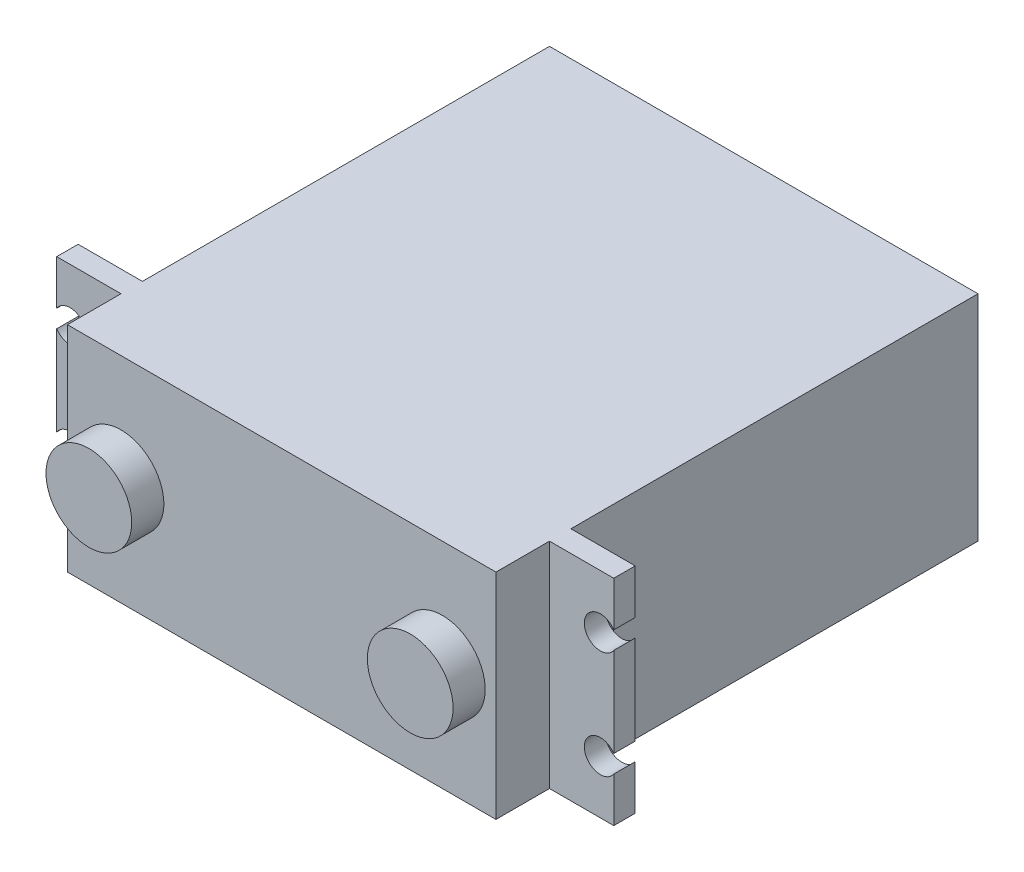
ISO-10303-21;
HEADER;
FILE_DESCRIPTION(('STEP AP214'),'2;1');
FILE_NAME('part.step','',(''),(''),'','','');
FILE_SCHEMA(('AUTOMOTIVE_DESIGN { 1 0 10303 214 1 1 1 1 }'));
ENDSEC;
DATA;
#1=APPLICATION_CONTEXT('core data for automotive mechanical design processes');
#2=APPLICATION_PROTOCOL_DEFINITION('international standard','automotive_design',2000,#1);
#3=PRODUCT_CONTEXT('',#1,'mechanical');
#4=PRODUCT('Part','Part','',(#3));
#5=PRODUCT_RELATED_PRODUCT_CATEGORY('part','',(#4));
#6=PRODUCT_DEFINITION_FORMATION('','',#4);
#7=PRODUCT_DEFINITION_CONTEXT('part definition',#1,'design');
#8=PRODUCT_DEFINITION('design','',#6,#7);
#9=PRODUCT_DEFINITION_SHAPE('','',#8);
#10=(LENGTH_UNIT() NAMED_UNIT(*) SI_UNIT(.MILLI.,.METRE.));
#11=(NAMED_UNIT(*) PLANE_ANGLE_UNIT() SI_UNIT($,.RADIAN.));
#12=(NAMED_UNIT(*) SI_UNIT($,.STERADIAN.) SOLID_ANGLE_UNIT());
#13=UNCERTAINTY_MEASURE_WITH_UNIT(LENGTH_MEASURE(1.E-05),#10,'distance_accuracy_value','');
#14=(GEOMETRIC_REPRESENTATION_CONTEXT(3) GLOBAL_UNCERTAINTY_ASSIGNED_CONTEXT((#13)) GLOBAL_UNIT_ASSIGNED_CONTEXT((#10,
#11,#12)) REPRESENTATION_CONTEXT('',''));
#15=CARTESIAN_POINT('',(0.,0.,0.));
#16=DIRECTION('',(0.,0.,1.));
#17=DIRECTION('',(1.,0.,0.));
#18=AXIS2_PLACEMENT_3D('',#15,#16,#17);
#19=CARTESIAN_POINT('',(-6.,0.,0.));
#20=DIRECTION('',(-1.,0.,0.));
#21=DIRECTION('',(0.,0.,1.));
#22=AXIS2_PLACEMENT_3D('',#19,#20,#21);
#23=PLANE('',#22);
#24=DIRECTION('',(0.,0.,1.));
#25=VECTOR('',#24,1.);
#26=CARTESIAN_POINT('',(-6.,4.17084380241115,34.));
#27=LINE('',#26,#25);
#28=CARTESIAN_POINT('',(-6.,4.17084380241115,38.));
#29=VERTEX_POINT('',#28);
#30=CARTESIAN_POINT('',(-6.,4.17084380241115,40.));
#31=VERTEX_POINT('',#30);
#32=EDGE_CURVE('E48',#29,#31,#27,.T.);
#33=ORIENTED_EDGE('',*,*,#32,.F.);
#34=DIRECTION('',(0.,-1.,0.));
#35=VECTOR('',#34,1.);
#36=CARTESIAN_POINT('',(-6.,20.,38.));
#37=LINE('',#36,#35);
#38=CARTESIAN_POINT('',(-6.,0.,38.));
#39=VERTEX_POINT('',#38);
#40=EDGE_CURVE('E230',#29,#39,#37,.T.);
#41=ORIENTED_EDGE('',*,*,#40,.T.);
#42=DIRECTION('',(0.,0.,1.));
#43=VECTOR('',#42,1.);
#44=CARTESIAN_POINT('',(-6.,0.,38.));
#45=LINE('',#44,#43);
#46=CARTESIAN_POINT('',(-6.,0.,40.));
#47=VERTEX_POINT('',#46);
#48=EDGE_CURVE('E228',#39,#47,#45,.T.);
#49=ORIENTED_EDGE('',*,*,#48,.T.);
#50=DIRECTION('',(0.,1.,0.));
#51=VECTOR('',#50,1.);
#52=CARTESIAN_POINT('',(-6.,20.,40.));
#53=LINE('',#52,#51);
#54=EDGE_CURVE('E233',#47,#31,#53,.T.);
#55=ORIENTED_EDGE('',*,*,#54,.T.);
#56=EDGE_LOOP('',(#33,#41,#49,#55));
#57=FACE_BOUND('',#56,.T.);
#58=ADVANCED_FACE('F33',(#57),#23,.T.);
#59=CARTESIAN_POINT('',(46.,0.,0.));
#60=DIRECTION('',(1.,0.,0.));
#61=DIRECTION('',(0.,0.,-1.));
#62=AXIS2_PLACEMENT_3D('',#59,#60,#61);
#63=PLANE('',#62);
#64=DIRECTION('',(0.,0.,1.));
#65=VECTOR('',#64,1.);
#66=CARTESIAN_POINT('',(46.,15.8291561975889,34.));
#67=LINE('',#66,#65);
#68=CARTESIAN_POINT('',(46.,15.8291561975889,38.));
#69=VERTEX_POINT('',#68);
#70=CARTESIAN_POINT('',(46.,15.8291561975889,40.));
#71=VERTEX_POINT('',#70);
#72=EDGE_CURVE('E41',#69,#71,#67,.T.);
#73=ORIENTED_EDGE('',*,*,#72,.F.);
#74=DIRECTION('',(0.,1.,0.));
#75=VECTOR('',#74,1.);
#76=CARTESIAN_POINT('',(46.,20.,38.));
#77=LINE('',#76,#75);
#78=CARTESIAN_POINT('',(46.,20.,38.));
#79=VERTEX_POINT('',#78);
#80=EDGE_CURVE('E200',#69,#79,#77,.T.);
#81=ORIENTED_EDGE('',*,*,#80,.T.);
#82=DIRECTION('',(0.,0.,1.));
#83=VECTOR('',#82,1.);
#84=CARTESIAN_POINT('',(46.,20.,40.));
#85=LINE('',#84,#83);
#86=CARTESIAN_POINT('',(46.,20.,40.));
#87=VERTEX_POINT('',#86);
#88=EDGE_CURVE('E204',#79,#87,#85,.T.);
#89=ORIENTED_EDGE('',*,*,#88,.T.);
#90=DIRECTION('',(0.,-1.,0.));
#91=VECTOR('',#90,1.);
#92=CARTESIAN_POINT('',(46.,20.,40.));
#93=LINE('',#92,#91);
#94=EDGE_CURVE('E190',#87,#71,#93,.T.);
#95=ORIENTED_EDGE('',*,*,#94,.T.);
#96=EDGE_LOOP('',(#73,#81,#89,#95));
#97=FACE_BOUND('',#96,.T.);
#98=ADVANCED_FACE('F318',(#97),#63,.T.);
#99=DIRECTION('',(0.,0.,1.));
#100=VECTOR('',#99,1.);
#101=CARTESIAN_POINT('',(46.,14.1708438024111,34.));
#102=LINE('',#101,#100);
#103=CARTESIAN_POINT('',(46.,14.1708438024111,40.));
#104=VERTEX_POINT('',#103);
#105=CARTESIAN_POINT('',(46.,14.1708438024111,38.));
#106=VERTEX_POINT('',#105);
#107=EDGE_CURVE('E175',#104,#106,#102,.F.);
#108=ORIENTED_EDGE('',*,*,#107,.F.);
#109=CARTESIAN_POINT('',(46.,5.82915619758885,40.));
#110=VERTEX_POINT('',#109);
#111=EDGE_CURVE('E183',#104,#110,#93,.T.);
#112=ORIENTED_EDGE('',*,*,#111,.T.);
#113=DIRECTION('',(0.,0.,1.));
#114=VECTOR('',#113,1.);
#115=CARTESIAN_POINT('',(46.,5.82915619758885,34.));
#116=LINE('',#115,#114);
#117=CARTESIAN_POINT('',(46.,5.82915619758885,38.));
#118=VERTEX_POINT('',#117);
#119=EDGE_CURVE('E167',#118,#110,#116,.T.);
#120=ORIENTED_EDGE('',*,*,#119,.F.);
#121=EDGE_CURVE('E205',#118,#106,#77,.T.);
#122=ORIENTED_EDGE('',*,*,#121,.T.);
#123=EDGE_LOOP('',(#108,#112,#120,#122));
#124=FACE_BOUND('',#123,.T.);
#125=ADVANCED_FACE('F189',(#124),#63,.T.);
#126=DIRECTION('',(0.,0.,1.));
#127=VECTOR('',#126,1.);
#128=CARTESIAN_POINT('',(-6.,5.82915619758885,34.));
#129=LINE('',#128,#127);
#130=CARTESIAN_POINT('',(-6.,5.82915619758885,40.));
#131=VERTEX_POINT('',#130);
#132=CARTESIAN_POINT('',(-6.,5.82915619758885,38.));
#133=VERTEX_POINT('',#132);
#134=EDGE_CURVE('E346',#131,#133,#129,.F.);
#135=ORIENTED_EDGE('',*,*,#134,.F.);
#136=CARTESIAN_POINT('',(-6.,14.1708438024112,40.));
#137=VERTEX_POINT('',#136);
#138=EDGE_CURVE('E237',#131,#137,#53,.T.);
#139=ORIENTED_EDGE('',*,*,#138,.T.);
#140=DIRECTION('',(0.,0.,1.));
#141=VECTOR('',#140,1.);
#142=CARTESIAN_POINT('',(-6.,14.1708438024112,34.));
#143=LINE('',#142,#141);
#144=CARTESIAN_POINT('',(-6.,14.1708438024112,38.));
#145=VERTEX_POINT('',#144);
#146=EDGE_CURVE('E305',#145,#137,#143,.T.);
#147=ORIENTED_EDGE('',*,*,#146,.F.);
#148=EDGE_CURVE('E229',#145,#133,#37,.T.);
#149=ORIENTED_EDGE('',*,*,#148,.T.);
#150=EDGE_LOOP('',(#135,#139,#147,#149));
#151=FACE_BOUND('',#150,.T.);
#152=ADVANCED_FACE('F377',(#151),#23,.T.);
#153=CARTESIAN_POINT('',(40.,0.,45.));
#154=DIRECTION('',(-1.,0.,0.));
#155=DIRECTION('',(0.,0.,1.));
#156=AXIS2_PLACEMENT_3D('',#153,#154,#155);
#157=PLANE('',#156);
#158=DIRECTION('',(0.,-1.,0.));
#159=VECTOR('',#158,1.);
#160=CARTESIAN_POINT('',(40.,20.,40.));
#161=LINE('',#160,#159);
#162=CARTESIAN_POINT('',(40.,20.,40.));
#163=VERTEX_POINT('',#162);
#164=CARTESIAN_POINT('',(40.,0.,40.));
#165=VERTEX_POINT('',#164);
#166=EDGE_CURVE('E208',#163,#165,#161,.T.);
#167=ORIENTED_EDGE('',*,*,#166,.F.);
#168=DIRECTION('',(0.,0.,-1.));
#169=VECTOR('',#168,1.);
#170=CARTESIAN_POINT('',(40.,20.,45.));
#171=LINE('',#170,#169);
#172=CARTESIAN_POINT('',(40.,20.,45.));
#173=VERTEX_POINT('',#172);
#174=EDGE_CURVE('E287',#173,#163,#171,.T.);
#175=ORIENTED_EDGE('',*,*,#174,.F.);
#176=DIRECTION('',(0.,1.,0.));
#177=VECTOR('',#176,1.);
#178=CARTESIAN_POINT('',(40.,0.,45.));
#179=LINE('',#178,#177);
#180=CARTESIAN_POINT('',(40.,0.,45.));
#181=VERTEX_POINT('',#180);
#182=EDGE_CURVE('E269',#181,#173,#179,.T.);
#183=ORIENTED_EDGE('',*,*,#182,.F.);
#184=DIRECTION('',(0.,0.,-1.));
#185=VECTOR('',#184,1.);
#186=CARTESIAN_POINT('',(40.,0.,45.));
#187=LINE('',#186,#185);
#188=EDGE_CURVE('E291',#181,#165,#187,.T.);
#189=ORIENTED_EDGE('',*,*,#188,.T.);
#190=EDGE_LOOP('',(#167,#175,#183,#189));
#191=FACE_BOUND('',#190,.T.);
#192=ADVANCED_FACE('F327',(#191),#157,.F.);
#193=DIRECTION('',(0.,1.,0.));
#194=VECTOR('',#193,1.);
#195=CARTESIAN_POINT('',(40.,20.,38.));
#196=LINE('',#195,#194);
#197=CARTESIAN_POINT('',(40.,0.,38.));
#198=VERTEX_POINT('',#197);
#199=CARTESIAN_POINT('',(40.,20.,38.));
#200=VERTEX_POINT('',#199);
#201=EDGE_CURVE('E194',#198,#200,#196,.T.);
#202=ORIENTED_EDGE('',*,*,#201,.F.);
#203=CARTESIAN_POINT('',(40.,0.,0.));
#204=VERTEX_POINT('',#203);
#205=EDGE_CURVE('E290',#198,#204,#187,.T.);
#206=ORIENTED_EDGE('',*,*,#205,.T.);
#207=DIRECTION('',(0.,1.,0.));
#208=VECTOR('',#207,1.);
#209=CARTESIAN_POINT('',(40.,0.,0.));
#210=LINE('',#209,#208);
#211=CARTESIAN_POINT('',(40.,20.,0.));
#212=VERTEX_POINT('',#211);
#213=EDGE_CURVE('E279',#204,#212,#210,.T.);
#214=ORIENTED_EDGE('',*,*,#213,.T.);
#215=EDGE_CURVE('E286',#200,#212,#171,.T.);
#216=ORIENTED_EDGE('',*,*,#215,.F.);
#217=EDGE_LOOP('',(#202,#206,#214,#216));
#218=FACE_BOUND('',#217,.T.);
#219=ADVANCED_FACE('F441',(#218),#157,.F.);
#220=CARTESIAN_POINT('',(0.,0.,45.));
#221=DIRECTION('',(1.,0.,0.));
#222=DIRECTION('',(0.,0.,-1.));
#223=AXIS2_PLACEMENT_3D('',#220,#221,#222);
#224=PLANE('',#223);
#225=DIRECTION('',(0.,-1.,0.));
#226=VECTOR('',#225,1.);
#227=CARTESIAN_POINT('',(0.,20.,38.));
#228=LINE('',#227,#226);
#229=CARTESIAN_POINT('',(0.,20.,38.));
#230=VERTEX_POINT('',#229);
#231=CARTESIAN_POINT('',(0.,0.,38.));
#232=VERTEX_POINT('',#231);
#233=EDGE_CURVE('E224',#230,#232,#228,.T.);
#234=ORIENTED_EDGE('',*,*,#233,.F.);
#235=DIRECTION('',(0.,0.,-1.));
#236=VECTOR('',#235,1.);
#237=CARTESIAN_POINT('',(0.,20.,45.));
#238=LINE('',#237,#236);
#239=CARTESIAN_POINT('',(0.,20.,0.));
#240=VERTEX_POINT('',#239);
#241=EDGE_CURVE('E273',#230,#240,#238,.T.);
#242=ORIENTED_EDGE('',*,*,#241,.T.);
#243=DIRECTION('',(0.,-1.,0.));
#244=VECTOR('',#243,1.);
#245=CARTESIAN_POINT('',(0.,0.,0.));
#246=LINE('',#245,#244);
#247=CARTESIAN_POINT('',(0.,0.,0.));
#248=VERTEX_POINT('',#247);
#249=EDGE_CURVE('E262',#240,#248,#246,.T.);
#250=ORIENTED_EDGE('',*,*,#249,.T.);
#251=DIRECTION('',(0.,0.,-1.));
#252=VECTOR('',#251,1.);
#253=CARTESIAN_POINT('',(0.,0.,45.));
#254=LINE('',#253,#252);
#255=EDGE_CURVE('E293',#232,#248,#254,.T.);
#256=ORIENTED_EDGE('',*,*,#255,.F.);
#257=EDGE_LOOP('',(#234,#242,#250,#256));
#258=FACE_BOUND('',#257,.T.);
#259=ADVANCED_FACE('F35',(#258),#224,.F.);
#260=DIRECTION('',(0.,1.,0.));
#261=VECTOR('',#260,1.);
#262=CARTESIAN_POINT('',(0.,20.,40.));
#263=LINE('',#262,#261);
#264=CARTESIAN_POINT('',(0.,0.,40.));
#265=VERTEX_POINT('',#264);
#266=CARTESIAN_POINT('',(0.,20.,40.));
#267=VERTEX_POINT('',#266);
#268=EDGE_CURVE('E242',#265,#267,#263,.T.);
#269=ORIENTED_EDGE('',*,*,#268,.F.);
#270=CARTESIAN_POINT('',(0.,0.,45.));
#271=VERTEX_POINT('',#270);
#272=EDGE_CURVE('E294',#271,#265,#254,.T.);
#273=ORIENTED_EDGE('',*,*,#272,.F.);
#274=DIRECTION('',(0.,-1.,0.));
#275=VECTOR('',#274,1.);
#276=CARTESIAN_POINT('',(0.,0.,45.));
#277=LINE('',#276,#275);
#278=CARTESIAN_POINT('',(0.,20.,45.));
#279=VERTEX_POINT('',#278);
#280=EDGE_CURVE('E263',#279,#271,#277,.T.);
#281=ORIENTED_EDGE('',*,*,#280,.F.);
#282=EDGE_CURVE('E284',#279,#267,#238,.T.);
#283=ORIENTED_EDGE('',*,*,#282,.T.);
#284=EDGE_LOOP('',(#269,#273,#281,#283));
#285=FACE_BOUND('',#284,.T.);
#286=ADVANCED_FACE('F386',(#285),#224,.F.);
#287=CARTESIAN_POINT('',(0.,0.,45.));
#288=DIRECTION('',(0.,1.,0.));
#289=DIRECTION('',(0.,0.,1.));
#290=AXIS2_PLACEMENT_3D('',#287,#288,#289);
#291=PLANE('',#290);
#292=DIRECTION('',(1.,0.,0.));
#293=VECTOR('',#292,1.);
#294=CARTESIAN_POINT('',(0.,0.,0.));
#295=LINE('',#294,#293);
#296=EDGE_CURVE('E276',#248,#204,#295,.T.);
#297=ORIENTED_EDGE('',*,*,#296,.T.);
#298=ORIENTED_EDGE('',*,*,#205,.F.);
#299=DIRECTION('',(-1.,0.,0.));
#300=VECTOR('',#299,1.);
#301=CARTESIAN_POINT('',(46.,0.,38.));
#302=LINE('',#301,#300);
#303=CARTESIAN_POINT('',(46.,0.,38.));
#304=VERTEX_POINT('',#303);
#305=EDGE_CURVE('E218',#304,#198,#302,.T.);
#306=ORIENTED_EDGE('',*,*,#305,.F.);
#307=DIRECTION('',(0.,0.,-1.));
#308=VECTOR('',#307,1.);
#309=CARTESIAN_POINT('',(46.,0.,40.));
#310=LINE('',#309,#308);
#311=CARTESIAN_POINT('',(46.,0.,40.));
#312=VERTEX_POINT('',#311);
#313=EDGE_CURVE('E193',#312,#304,#310,.T.);
#314=ORIENTED_EDGE('',*,*,#313,.F.);
#315=DIRECTION('',(-1.,0.,0.));
#316=VECTOR('',#315,1.);
#317=CARTESIAN_POINT('',(46.,0.,40.));
#318=LINE('',#317,#316);
#319=EDGE_CURVE('E221',#312,#165,#318,.T.);
#320=ORIENTED_EDGE('',*,*,#319,.T.);
#321=ORIENTED_EDGE('',*,*,#188,.F.);
#322=DIRECTION('',(1.,0.,0.));
#323=VECTOR('',#322,1.);
#324=CARTESIAN_POINT('',(0.,0.,45.));
#325=LINE('',#324,#323);
#326=EDGE_CURVE('E266',#271,#181,#325,.T.);
#327=ORIENTED_EDGE('',*,*,#326,.F.);
#328=ORIENTED_EDGE('',*,*,#272,.T.);
#329=DIRECTION('',(1.,0.,0.));
#330=VECTOR('',#329,1.);
#331=CARTESIAN_POINT('',(-6.,0.,40.));
#332=LINE('',#331,#330);
#333=EDGE_CURVE('E250',#47,#265,#332,.T.);
#334=ORIENTED_EDGE('',*,*,#333,.F.);
#335=ORIENTED_EDGE('',*,*,#48,.F.);
#336=DIRECTION('',(1.,0.,0.));
#337=VECTOR('',#336,1.);
#338=CARTESIAN_POINT('',(-6.,0.,38.));
#339=LINE('',#338,#337);
#340=EDGE_CURVE('E253',#39,#232,#339,.T.);
#341=ORIENTED_EDGE('',*,*,#340,.T.);
#342=ORIENTED_EDGE('',*,*,#255,.T.);
#343=EDGE_LOOP('',(#297,#298,#306,#314,#320,#321,#327,#328,#334,#335,#341,#342));
#344=FACE_BOUND('',#343,.T.);
#345=ADVANCED_FACE('F332',(#344),#291,.F.);
#346=CARTESIAN_POINT('',(0.,20.,45.));
#347=DIRECTION('',(0.,-1.,0.));
#348=DIRECTION('',(0.,0.,-1.));
#349=AXIS2_PLACEMENT_3D('',#346,#347,#348);
#350=PLANE('',#349);
#351=DIRECTION('',(-1.,0.,0.));
#352=VECTOR('',#351,1.);
#353=CARTESIAN_POINT('',(0.,20.,0.));
#354=LINE('',#353,#352);
#355=EDGE_CURVE('E267',#212,#240,#354,.T.);
#356=ORIENTED_EDGE('',*,*,#355,.T.);
#357=ORIENTED_EDGE('',*,*,#241,.F.);
#358=DIRECTION('',(1.,0.,0.));
#359=VECTOR('',#358,1.);
#360=CARTESIAN_POINT('',(-6.,20.,38.));
#361=LINE('',#360,#359);
#362=CARTESIAN_POINT('',(-6.,20.,38.));
#363=VERTEX_POINT('',#362);
#364=EDGE_CURVE('E239',#363,#230,#361,.T.);
#365=ORIENTED_EDGE('',*,*,#364,.F.);
#366=DIRECTION('',(0.,0.,-1.));
#367=VECTOR('',#366,1.);
#368=CARTESIAN_POINT('',(-6.,20.,38.));
#369=LINE('',#368,#367);
#370=CARTESIAN_POINT('',(-6.,20.,40.));
#371=VERTEX_POINT('',#370);
#372=EDGE_CURVE('E236',#371,#363,#369,.T.);
#373=ORIENTED_EDGE('',*,*,#372,.F.);
#374=DIRECTION('',(1.,0.,0.));
#375=VECTOR('',#374,1.);
#376=CARTESIAN_POINT('',(-6.,20.,40.));
#377=LINE('',#376,#375);
#378=EDGE_CURVE('E247',#371,#267,#377,.T.);
#379=ORIENTED_EDGE('',*,*,#378,.T.);
#380=ORIENTED_EDGE('',*,*,#282,.F.);
#381=DIRECTION('',(-1.,0.,0.));
#382=VECTOR('',#381,1.);
#383=CARTESIAN_POINT('',(0.,20.,45.));
#384=LINE('',#383,#382);
#385=EDGE_CURVE('E271',#173,#279,#384,.T.);
#386=ORIENTED_EDGE('',*,*,#385,.F.);
#387=ORIENTED_EDGE('',*,*,#174,.T.);
#388=DIRECTION('',(-1.,0.,0.));
#389=VECTOR('',#388,1.);
#390=CARTESIAN_POINT('',(46.,20.,40.));
#391=LINE('',#390,#389);
#392=EDGE_CURVE('E207',#87,#163,#391,.T.);
#393=ORIENTED_EDGE('',*,*,#392,.F.);
#394=ORIENTED_EDGE('',*,*,#88,.F.);
#395=DIRECTION('',(-1.,0.,0.));
#396=VECTOR('',#395,1.);
#397=CARTESIAN_POINT('',(46.,20.,38.));
#398=LINE('',#397,#396);
#399=EDGE_CURVE('E215',#79,#200,#398,.T.);
#400=ORIENTED_EDGE('',*,*,#399,.T.);
#401=ORIENTED_EDGE('',*,*,#215,.T.);
#402=EDGE_LOOP('',(#356,#357,#365,#373,#379,#380,#386,#387,#393,#394,#400,#401));
#403=FACE_BOUND('',#402,.T.);
#404=ADVANCED_FACE('F323',(#403),#350,.F.);
#405=CARTESIAN_POINT('',(0.,0.,45.));
#406=DIRECTION('',(0.,0.,-1.));
#407=DIRECTION('',(-1.,0.,0.));
#408=AXIS2_PLACEMENT_3D('',#405,#406,#407);
#409=PLANE('',#408);
#410=CARTESIAN_POINT('',(35.,10.,45.));
#411=DIRECTION('',(0.,0.,-1.));
#412=DIRECTION('',(-1.,0.,0.));
#413=AXIS2_PLACEMENT_3D('',#410,#411,#412);
#414=CIRCLE('',#413,4.);
#415=CARTESIAN_POINT('',(31.,10.,45.));
#416=VERTEX_POINT('',#415);
#417=EDGE_CURVE('E300',#416,#416,#414,.F.);
#418=ORIENTED_EDGE('',*,*,#417,.F.);
#419=EDGE_LOOP('',(#418));
#420=FACE_BOUND('',#419,.T.);
#421=CARTESIAN_POINT('',(5.,10.,45.));
#422=DIRECTION('',(0.,0.,-1.));
#423=DIRECTION('',(-1.,0.,0.));
#424=AXIS2_PLACEMENT_3D('',#421,#422,#423);
#425=CIRCLE('',#424,4.);
#426=CARTESIAN_POINT('',(0.999999999999998,10.,45.));
#427=VERTEX_POINT('',#426);
#428=EDGE_CURVE('E297',#427,#427,#425,.F.);
#429=ORIENTED_EDGE('',*,*,#428,.F.);
#430=EDGE_LOOP('',(#429));
#431=FACE_BOUND('',#430,.T.);
#432=ORIENTED_EDGE('',*,*,#280,.T.);
#433=ORIENTED_EDGE('',*,*,#326,.T.);
#434=ORIENTED_EDGE('',*,*,#182,.T.);
#435=ORIENTED_EDGE('',*,*,#385,.T.);
#436=EDGE_LOOP('',(#432,#433,#434,#435));
#437=FACE_BOUND('',#436,.T.);
#438=ADVANCED_FACE('F388',(#420,#431,#437),#409,.F.);
#439=CARTESIAN_POINT('',(0.,0.,0.));
#440=DIRECTION('',(0.,0.,-1.));
#441=DIRECTION('',(-1.,0.,0.));
#442=AXIS2_PLACEMENT_3D('',#439,#440,#441);
#443=PLANE('',#442);
#444=ORIENTED_EDGE('',*,*,#249,.F.);
#445=ORIENTED_EDGE('',*,*,#355,.F.);
#446=ORIENTED_EDGE('',*,*,#213,.F.);
#447=ORIENTED_EDGE('',*,*,#296,.F.);
#448=EDGE_LOOP('',(#444,#445,#446,#447));
#449=FACE_BOUND('',#448,.T.);
#450=ADVANCED_FACE('F430',(#449),#443,.T.);
#451=CARTESIAN_POINT('',(5.,10.,48.));
#452=DIRECTION('',(0.,0.,-1.));
#453=DIRECTION('',(-1.,0.,0.));
#454=AXIS2_PLACEMENT_3D('',#451,#452,#453);
#455=CYLINDRICAL_SURFACE('',#454,4.);
#456=CARTESIAN_POINT('',(5.,10.,48.));
#457=DIRECTION('',(0.,0.,1.));
#458=DIRECTION('',(1.,0.,0.));
#459=AXIS2_PLACEMENT_3D('',#456,#457,#458);
#460=CIRCLE('',#459,4.);
#461=CARTESIAN_POINT('',(9.,10.,48.));
#462=VERTEX_POINT('',#461);
#463=EDGE_CURVE('E259',#462,#462,#460,.T.);
#464=ORIENTED_EDGE('',*,*,#463,.F.);
#465=EDGE_LOOP('',(#464));
#466=FACE_BOUND('',#465,.T.);
#467=ORIENTED_EDGE('',*,*,#428,.T.);
#468=EDGE_LOOP('',(#467));
#469=FACE_BOUND('',#468,.T.);
#470=ADVANCED_FACE('F426',(#466,#469),#455,.T.);
#471=CARTESIAN_POINT('',(5.,10.,48.));
#472=DIRECTION('',(0.,0.,1.));
#473=DIRECTION('',(1.,0.,0.));
#474=AXIS2_PLACEMENT_3D('',#471,#472,#473);
#475=PLANE('',#474);
#476=ORIENTED_EDGE('',*,*,#463,.T.);
#477=EDGE_LOOP('',(#476));
#478=FACE_BOUND('',#477,.T.);
#479=ADVANCED_FACE('F422',(#478),#475,.T.);
#480=CARTESIAN_POINT('',(35.,10.,48.));
#481=DIRECTION('',(0.,0.,-1.));
#482=DIRECTION('',(-1.,0.,0.));
#483=AXIS2_PLACEMENT_3D('',#480,#481,#482);
#484=CYLINDRICAL_SURFACE('',#483,4.);
#485=CARTESIAN_POINT('',(35.,10.,48.));
#486=DIRECTION('',(0.,0.,1.));
#487=DIRECTION('',(1.,0.,0.));
#488=AXIS2_PLACEMENT_3D('',#485,#486,#487);
#489=CIRCLE('',#488,4.);
#490=CARTESIAN_POINT('',(39.,10.,48.));
#491=VERTEX_POINT('',#490);
#492=EDGE_CURVE('E256',#491,#491,#489,.T.);
#493=ORIENTED_EDGE('',*,*,#492,.F.);
#494=EDGE_LOOP('',(#493));
#495=FACE_BOUND('',#494,.T.);
#496=ORIENTED_EDGE('',*,*,#417,.T.);
#497=EDGE_LOOP('',(#496));
#498=FACE_BOUND('',#497,.T.);
#499=ADVANCED_FACE('F418',(#495,#498),#484,.T.);
#500=CARTESIAN_POINT('',(35.,10.,48.));
#501=DIRECTION('',(0.,0.,1.));
#502=DIRECTION('',(1.,0.,0.));
#503=AXIS2_PLACEMENT_3D('',#500,#501,#502);
#504=PLANE('',#503);
#505=ORIENTED_EDGE('',*,*,#492,.T.);
#506=EDGE_LOOP('',(#505));
#507=FACE_BOUND('',#506,.T.);
#508=ADVANCED_FACE('F413',(#507),#504,.T.);
#509=CARTESIAN_POINT('',(-6.,20.,38.));
#510=DIRECTION('',(0.,0.,1.));
#511=DIRECTION('',(1.,0.,0.));
#512=AXIS2_PLACEMENT_3D('',#509,#510,#511);
#513=PLANE('',#512);
#514=ORIENTED_EDGE('',*,*,#40,.F.);
#515=CARTESIAN_POINT('',(-4.75,5.,38.));
#516=DIRECTION('',(0.,0.,1.));
#517=DIRECTION('',(1.,0.,0.));
#518=AXIS2_PLACEMENT_3D('',#515,#516,#517);
#519=CIRCLE('',#518,1.5);
#520=EDGE_CURVE('E341',#29,#133,#519,.T.);
#521=ORIENTED_EDGE('',*,*,#520,.T.);
#522=ORIENTED_EDGE('',*,*,#148,.F.);
#523=CARTESIAN_POINT('',(-4.75,15.,38.));
#524=DIRECTION('',(0.,0.,1.));
#525=DIRECTION('',(1.,0.,0.));
#526=AXIS2_PLACEMENT_3D('',#523,#524,#525);
#527=CIRCLE('',#526,1.5);
#528=CARTESIAN_POINT('',(-6.,15.8291561975888,38.));
#529=VERTEX_POINT('',#528);
#530=EDGE_CURVE('E197',#145,#529,#527,.T.);
#531=ORIENTED_EDGE('',*,*,#530,.T.);
#532=EDGE_CURVE('E225',#363,#529,#37,.T.);
#533=ORIENTED_EDGE('',*,*,#532,.F.);
#534=ORIENTED_EDGE('',*,*,#364,.T.);
#535=ORIENTED_EDGE('',*,*,#233,.T.);
#536=ORIENTED_EDGE('',*,*,#340,.F.);
#537=EDGE_LOOP('',(#514,#521,#522,#531,#533,#534,#535,#536));
#538=FACE_BOUND('',#537,.T.);
#539=ADVANCED_FACE('F357',(#538),#513,.F.);
#540=CARTESIAN_POINT('',(-6.,20.,40.));
#541=DIRECTION('',(0.,0.,-1.));
#542=DIRECTION('',(-1.,0.,0.));
#543=AXIS2_PLACEMENT_3D('',#540,#541,#542);
#544=PLANE('',#543);
#545=ORIENTED_EDGE('',*,*,#138,.F.);
#546=CARTESIAN_POINT('',(-4.75,5.,40.));
#547=DIRECTION('',(0.,0.,-1.));
#548=DIRECTION('',(-1.,0.,0.));
#549=AXIS2_PLACEMENT_3D('',#546,#547,#548);
#550=CIRCLE('',#549,1.5);
#551=EDGE_CURVE('E11',#131,#31,#550,.T.);
#552=ORIENTED_EDGE('',*,*,#551,.T.);
#553=ORIENTED_EDGE('',*,*,#54,.F.);
#554=ORIENTED_EDGE('',*,*,#333,.T.);
#555=ORIENTED_EDGE('',*,*,#268,.T.);
#556=ORIENTED_EDGE('',*,*,#378,.F.);
#557=CARTESIAN_POINT('',(-6.,15.8291561975888,40.));
#558=VERTEX_POINT('',#557);
#559=EDGE_CURVE('E232',#558,#371,#53,.T.);
#560=ORIENTED_EDGE('',*,*,#559,.F.);
#561=CARTESIAN_POINT('',(-4.75,15.,40.));
#562=DIRECTION('',(0.,0.,1.));
#563=DIRECTION('',(1.,0.,0.));
#564=AXIS2_PLACEMENT_3D('',#561,#562,#563);
#565=CIRCLE('',#564,1.5);
#566=EDGE_CURVE('E348',#137,#558,#565,.T.);
#567=ORIENTED_EDGE('',*,*,#566,.F.);
#568=EDGE_LOOP('',(#545,#552,#553,#554,#555,#556,#560,#567));
#569=FACE_BOUND('',#568,.T.);
#570=ADVANCED_FACE('F381',(#569),#544,.F.);
#571=DIRECTION('',(0.,0.,1.));
#572=VECTOR('',#571,1.);
#573=CARTESIAN_POINT('',(-6.,15.8291561975888,34.));
#574=LINE('',#573,#572);
#575=EDGE_CURVE('E303',#558,#529,#574,.F.);
#576=ORIENTED_EDGE('',*,*,#575,.F.);
#577=ORIENTED_EDGE('',*,*,#559,.T.);
#578=ORIENTED_EDGE('',*,*,#372,.T.);
#579=ORIENTED_EDGE('',*,*,#532,.T.);
#580=EDGE_LOOP('',(#576,#577,#578,#579));
#581=FACE_BOUND('',#580,.T.);
#582=ADVANCED_FACE('F361',(#581),#23,.T.);
#583=CARTESIAN_POINT('',(46.,20.,40.));
#584=DIRECTION('',(0.,0.,-1.));
#585=DIRECTION('',(-1.,0.,0.));
#586=AXIS2_PLACEMENT_3D('',#583,#584,#585);
#587=PLANE('',#586);
#588=ORIENTED_EDGE('',*,*,#111,.F.);
#589=CARTESIAN_POINT('',(44.75,15.,40.));
#590=DIRECTION('',(0.,0.,1.));
#591=DIRECTION('',(1.,0.,0.));
#592=AXIS2_PLACEMENT_3D('',#589,#590,#591);
#593=CIRCLE('',#592,1.5);
#594=EDGE_CURVE('E186',#71,#104,#593,.T.);
#595=ORIENTED_EDGE('',*,*,#594,.F.);
#596=ORIENTED_EDGE('',*,*,#94,.F.);
#597=ORIENTED_EDGE('',*,*,#392,.T.);
#598=ORIENTED_EDGE('',*,*,#166,.T.);
#599=ORIENTED_EDGE('',*,*,#319,.F.);
#600=CARTESIAN_POINT('',(46.,4.17084380241115,40.));
#601=VERTEX_POINT('',#600);
#602=EDGE_CURVE('E185',#601,#312,#93,.T.);
#603=ORIENTED_EDGE('',*,*,#602,.F.);
#604=CARTESIAN_POINT('',(44.75,5.,40.));
#605=DIRECTION('',(0.,0.,1.));
#606=DIRECTION('',(1.,0.,0.));
#607=AXIS2_PLACEMENT_3D('',#604,#605,#606);
#608=CIRCLE('',#607,1.5);
#609=EDGE_CURVE('E55',#110,#601,#608,.T.);
#610=ORIENTED_EDGE('',*,*,#609,.F.);
#611=EDGE_LOOP('',(#588,#595,#596,#597,#598,#599,#603,#610));
#612=FACE_BOUND('',#611,.T.);
#613=ADVANCED_FACE('F181',(#612),#587,.F.);
#614=CARTESIAN_POINT('',(46.,20.,38.));
#615=DIRECTION('',(0.,0.,1.));
#616=DIRECTION('',(1.,0.,0.));
#617=AXIS2_PLACEMENT_3D('',#614,#615,#616);
#618=PLANE('',#617);
#619=ORIENTED_EDGE('',*,*,#80,.F.);
#620=CARTESIAN_POINT('',(44.75,15.,38.));
#621=DIRECTION('',(0.,0.,1.));
#622=DIRECTION('',(1.,0.,0.));
#623=AXIS2_PLACEMENT_3D('',#620,#621,#622);
#624=CIRCLE('',#623,1.5);
#625=EDGE_CURVE('E313',#69,#106,#624,.T.);
#626=ORIENTED_EDGE('',*,*,#625,.T.);
#627=ORIENTED_EDGE('',*,*,#121,.F.);
#628=CARTESIAN_POINT('',(44.75,5.,38.));
#629=DIRECTION('',(0.,0.,1.));
#630=DIRECTION('',(1.,0.,0.));
#631=AXIS2_PLACEMENT_3D('',#628,#629,#630);
#632=CIRCLE('',#631,1.5);
#633=CARTESIAN_POINT('',(46.,4.17084380241115,38.));
#634=VERTEX_POINT('',#633);
#635=EDGE_CURVE('E170',#118,#634,#632,.T.);
#636=ORIENTED_EDGE('',*,*,#635,.T.);
#637=EDGE_CURVE('E201',#304,#634,#77,.T.);
#638=ORIENTED_EDGE('',*,*,#637,.F.);
#639=ORIENTED_EDGE('',*,*,#305,.T.);
#640=ORIENTED_EDGE('',*,*,#201,.T.);
#641=ORIENTED_EDGE('',*,*,#399,.F.);
#642=EDGE_LOOP('',(#619,#626,#627,#636,#638,#639,#640,#641));
#643=FACE_BOUND('',#642,.T.);
#644=ADVANCED_FACE('F339',(#643),#618,.F.);
#645=DIRECTION('',(0.,0.,1.));
#646=VECTOR('',#645,1.);
#647=CARTESIAN_POINT('',(46.,4.17084380241115,34.));
#648=LINE('',#647,#646);
#649=EDGE_CURVE('E176',#601,#634,#648,.F.);
#650=ORIENTED_EDGE('',*,*,#649,.F.);
#651=ORIENTED_EDGE('',*,*,#602,.T.);
#652=ORIENTED_EDGE('',*,*,#313,.T.);
#653=ORIENTED_EDGE('',*,*,#637,.T.);
#654=EDGE_LOOP('',(#650,#651,#652,#653));
#655=FACE_BOUND('',#654,.T.);
#656=ADVANCED_FACE('F337',(#655),#63,.T.);
#657=CARTESIAN_POINT('',(-4.75,15.,34.));
#658=DIRECTION('',(0.,0.,1.));
#659=DIRECTION('',(1.,0.,0.));
#660=AXIS2_PLACEMENT_3D('',#657,#658,#659);
#661=CYLINDRICAL_SURFACE('',#660,1.5);
#662=ORIENTED_EDGE('',*,*,#146,.T.);
#663=ORIENTED_EDGE('',*,*,#566,.T.);
#664=ORIENTED_EDGE('',*,*,#575,.T.);
#665=ORIENTED_EDGE('',*,*,#530,.F.);
#666=EDGE_LOOP('',(#662,#663,#664,#665));
#667=FACE_BOUND('',#666,.T.);
#668=ADVANCED_FACE('F379',(#667),#661,.F.);
#669=CARTESIAN_POINT('',(44.75,5.,34.));
#670=DIRECTION('',(0.,0.,1.));
#671=DIRECTION('',(1.,0.,0.));
#672=AXIS2_PLACEMENT_3D('',#669,#670,#671);
#673=CYLINDRICAL_SURFACE('',#672,1.5);
#674=ORIENTED_EDGE('',*,*,#119,.T.);
#675=ORIENTED_EDGE('',*,*,#609,.T.);
#676=ORIENTED_EDGE('',*,*,#649,.T.);
#677=ORIENTED_EDGE('',*,*,#635,.F.);
#678=EDGE_LOOP('',(#674,#675,#676,#677));
#679=FACE_BOUND('',#678,.T.);
#680=ADVANCED_FACE('F168',(#679),#673,.F.);
#681=CARTESIAN_POINT('',(44.75,15.,34.));
#682=DIRECTION('',(0.,0.,1.));
#683=DIRECTION('',(1.,0.,0.));
#684=AXIS2_PLACEMENT_3D('',#681,#682,#683);
#685=CYLINDRICAL_SURFACE('',#684,1.5);
#686=ORIENTED_EDGE('',*,*,#72,.T.);
#687=ORIENTED_EDGE('',*,*,#594,.T.);
#688=ORIENTED_EDGE('',*,*,#107,.T.);
#689=ORIENTED_EDGE('',*,*,#625,.F.);
#690=EDGE_LOOP('',(#686,#687,#688,#689));
#691=FACE_BOUND('',#690,.T.);
#692=ADVANCED_FACE('F311',(#691),#685,.F.);
#693=CARTESIAN_POINT('',(-4.75,5.,34.));
#694=DIRECTION('',(0.,0.,1.));
#695=DIRECTION('',(1.,0.,0.));
#696=AXIS2_PLACEMENT_3D('',#693,#694,#695);
#697=CYLINDRICAL_SURFACE('',#696,1.5);
#698=ORIENTED_EDGE('',*,*,#32,.T.);
#699=ORIENTED_EDGE('',*,*,#551,.F.);
#700=ORIENTED_EDGE('',*,*,#134,.T.);
#701=ORIENTED_EDGE('',*,*,#520,.F.);
#702=EDGE_LOOP('',(#698,#699,#700,#701));
#703=FACE_BOUND('',#702,.T.);
#704=ADVANCED_FACE('F389',(#703),#697,.F.);
#705=CLOSED_SHELL('',(#58,#98,#125,#152,#192,#219,#259,#286,#345,#404,#438,#450,#470,#479,#499,
#508,#539,#570,#582,#613,#644,#656,#668,#680,#692,#704));
#706=MANIFOLD_SOLID_BREP('B2',#705);
#707=ADVANCED_BREP_SHAPE_REPRESENTATION('',(#18,#706),#14);
#708=SHAPE_DEFINITION_REPRESENTATION(#9,#707);
ENDSEC;
END-ISO-10303-21;
